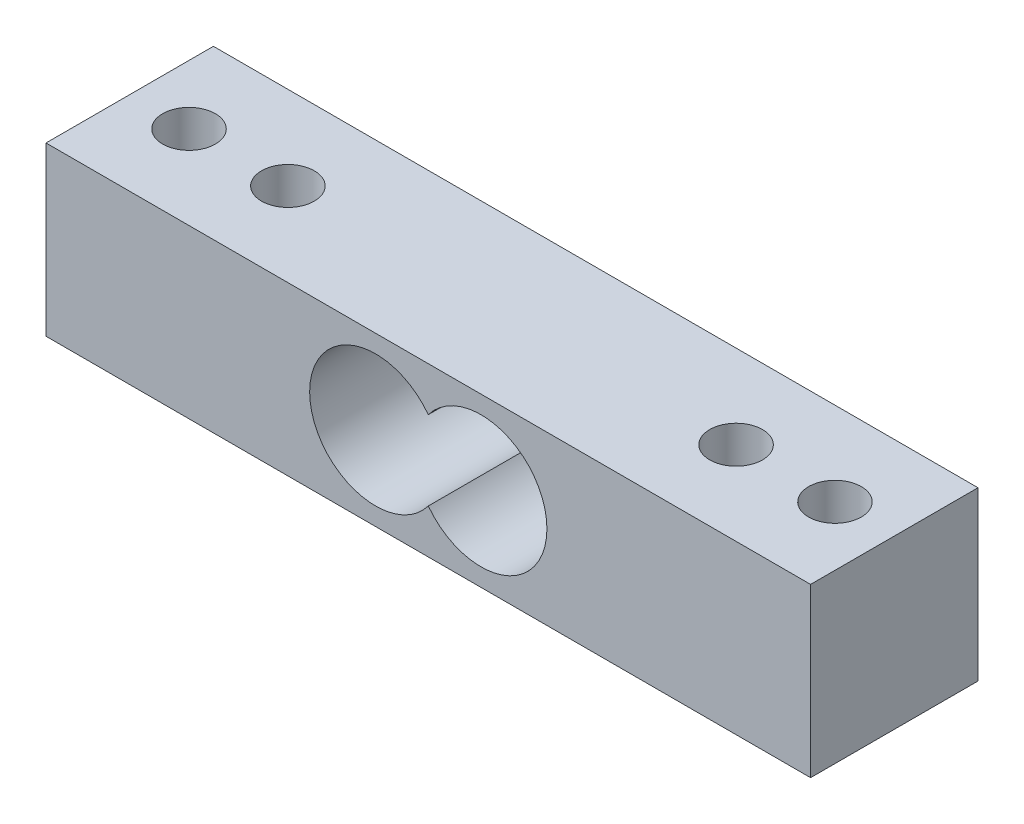
ISO-10303-21;
HEADER;
FILE_DESCRIPTION(('STEP AP214'),'2;1');
FILE_NAME('part.step','',(''),(''),'','','');
FILE_SCHEMA(('AUTOMOTIVE_DESIGN { 1 0 10303 214 1 1 1 1 }'));
ENDSEC;
DATA;
#1=APPLICATION_CONTEXT('core data for automotive mechanical design processes');
#2=APPLICATION_PROTOCOL_DEFINITION('international standard','automotive_design',2000,#1);
#3=PRODUCT_CONTEXT('',#1,'mechanical');
#4=PRODUCT('Part','Part','',(#3));
#5=PRODUCT_RELATED_PRODUCT_CATEGORY('part','',(#4));
#6=PRODUCT_DEFINITION_FORMATION('','',#4);
#7=PRODUCT_DEFINITION_CONTEXT('part definition',#1,'design');
#8=PRODUCT_DEFINITION('design','',#6,#7);
#9=PRODUCT_DEFINITION_SHAPE('','',#8);
#10=(LENGTH_UNIT() NAMED_UNIT(*) SI_UNIT(.MILLI.,.METRE.));
#11=(NAMED_UNIT(*) PLANE_ANGLE_UNIT() SI_UNIT($,.RADIAN.));
#12=(NAMED_UNIT(*) SI_UNIT($,.STERADIAN.) SOLID_ANGLE_UNIT());
#13=UNCERTAINTY_MEASURE_WITH_UNIT(LENGTH_MEASURE(1.E-05),#10,'distance_accuracy_value','');
#14=(GEOMETRIC_REPRESENTATION_CONTEXT(3) GLOBAL_UNCERTAINTY_ASSIGNED_CONTEXT((#13)) GLOBAL_UNIT_ASSIGNED_CONTEXT((#10,
#11,#12)) REPRESENTATION_CONTEXT('',''));
#15=CARTESIAN_POINT('',(0.,0.,0.));
#16=DIRECTION('',(0.,0.,1.));
#17=DIRECTION('',(1.,0.,0.));
#18=AXIS2_PLACEMENT_3D('',#15,#16,#17);
#19=CARTESIAN_POINT('',(0.,12.7,0.));
#20=DIRECTION('',(0.,1.,0.));
#21=DIRECTION('',(0.,0.,1.));
#22=AXIS2_PLACEMENT_3D('',#19,#20,#21);
#23=PLANE('',#22);
#24=CARTESIAN_POINT('',(-17.,12.7,0.));
#25=DIRECTION('',(0.,1.,0.));
#26=DIRECTION('',(0.,0.,1.));
#27=AXIS2_PLACEMENT_3D('',#24,#25,#26);
#28=CIRCLE('',#27,2.);
#29=CARTESIAN_POINT('',(-17.,12.7,2.));
#30=VERTEX_POINT('',#29);
#31=EDGE_CURVE('E110',#30,#30,#28,.T.);
#32=ORIENTED_EDGE('',*,*,#31,.F.);
#33=EDGE_LOOP('',(#32));
#34=FACE_BOUND('',#33,.T.);
#35=CARTESIAN_POINT('',(-24.5,12.7,0.));
#36=DIRECTION('',(0.,1.,0.));
#37=DIRECTION('',(0.,0.,1.));
#38=AXIS2_PLACEMENT_3D('',#35,#36,#37);
#39=CIRCLE('',#38,2.);
#40=CARTESIAN_POINT('',(-24.5,12.7,2.));
#41=VERTEX_POINT('',#40);
#42=EDGE_CURVE('E122',#41,#41,#39,.T.);
#43=ORIENTED_EDGE('',*,*,#42,.F.);
#44=EDGE_LOOP('',(#43));
#45=FACE_BOUND('',#44,.T.);
#46=DIRECTION('',(0.,0.,-1.));
#47=VECTOR('',#46,1.);
#48=CARTESIAN_POINT('',(29.,12.7,-6.35));
#49=LINE('',#48,#47);
#50=CARTESIAN_POINT('',(29.,12.7,6.34999999999999));
#51=VERTEX_POINT('',#50);
#52=CARTESIAN_POINT('',(29.,12.7,-6.35));
#53=VERTEX_POINT('',#52);
#54=EDGE_CURVE('E128',#51,#53,#49,.T.);
#55=ORIENTED_EDGE('',*,*,#54,.T.);
#56=DIRECTION('',(-1.,0.,0.));
#57=VECTOR('',#56,1.);
#58=CARTESIAN_POINT('',(-29.,12.7,-6.35));
#59=LINE('',#58,#57);
#60=CARTESIAN_POINT('',(-29.,12.7,-6.35));
#61=VERTEX_POINT('',#60);
#62=EDGE_CURVE('E131',#53,#61,#59,.T.);
#63=ORIENTED_EDGE('',*,*,#62,.T.);
#64=DIRECTION('',(0.,0.,1.));
#65=VECTOR('',#64,1.);
#66=CARTESIAN_POINT('',(-29.,12.7,-6.35));
#67=LINE('',#66,#65);
#68=CARTESIAN_POINT('',(-29.,12.7,6.34999999999999));
#69=VERTEX_POINT('',#68);
#70=EDGE_CURVE('E134',#61,#69,#67,.T.);
#71=ORIENTED_EDGE('',*,*,#70,.T.);
#72=DIRECTION('',(1.,0.,0.));
#73=VECTOR('',#72,1.);
#74=CARTESIAN_POINT('',(-29.,12.7,6.34999999999999));
#75=LINE('',#74,#73);
#76=EDGE_CURVE('E136',#69,#51,#75,.T.);
#77=ORIENTED_EDGE('',*,*,#76,.T.);
#78=EDGE_LOOP('',(#55,#63,#71,#77));
#79=FACE_BOUND('',#78,.T.);
#80=CARTESIAN_POINT('',(24.5,12.7,0.));
#81=DIRECTION('',(0.,1.,0.));
#82=DIRECTION('',(0.,0.,1.));
#83=AXIS2_PLACEMENT_3D('',#80,#81,#82);
#84=CIRCLE('',#83,2.);
#85=CARTESIAN_POINT('',(24.5,12.7,2.));
#86=VERTEX_POINT('',#85);
#87=EDGE_CURVE('E116',#86,#86,#84,.T.);
#88=ORIENTED_EDGE('',*,*,#87,.F.);
#89=EDGE_LOOP('',(#88));
#90=FACE_BOUND('',#89,.T.);
#91=CARTESIAN_POINT('',(17.,12.7,0.));
#92=DIRECTION('',(0.,1.,0.));
#93=DIRECTION('',(0.,0.,1.));
#94=AXIS2_PLACEMENT_3D('',#91,#92,#93);
#95=CIRCLE('',#94,2.);
#96=CARTESIAN_POINT('',(17.,12.7,2.));
#97=VERTEX_POINT('',#96);
#98=EDGE_CURVE('E104',#97,#97,#95,.T.);
#99=ORIENTED_EDGE('',*,*,#98,.F.);
#100=EDGE_LOOP('',(#99));
#101=FACE_BOUND('',#100,.T.);
#102=ADVANCED_FACE('F33',(#34,#45,#79,#90,#101),#23,.T.);
#103=CARTESIAN_POINT('',(0.,0.,0.));
#104=DIRECTION('',(0.,1.,0.));
#105=DIRECTION('',(0.,0.,1.));
#106=AXIS2_PLACEMENT_3D('',#103,#104,#105);
#107=PLANE('',#106);
#108=CARTESIAN_POINT('',(-17.,0.,0.));
#109=DIRECTION('',(0.,1.,0.));
#110=DIRECTION('',(0.,0.,1.));
#111=AXIS2_PLACEMENT_3D('',#108,#109,#110);
#112=CIRCLE('',#111,2.);
#113=CARTESIAN_POINT('',(-17.,0.,2.));
#114=VERTEX_POINT('',#113);
#115=EDGE_CURVE('E107',#114,#114,#112,.T.);
#116=ORIENTED_EDGE('',*,*,#115,.T.);
#117=EDGE_LOOP('',(#116));
#118=FACE_BOUND('',#117,.T.);
#119=CARTESIAN_POINT('',(-24.5,0.,0.));
#120=DIRECTION('',(0.,1.,0.));
#121=DIRECTION('',(0.,0.,1.));
#122=AXIS2_PLACEMENT_3D('',#119,#120,#121);
#123=CIRCLE('',#122,2.);
#124=CARTESIAN_POINT('',(-24.5,0.,2.));
#125=VERTEX_POINT('',#124);
#126=EDGE_CURVE('E119',#125,#125,#123,.T.);
#127=ORIENTED_EDGE('',*,*,#126,.T.);
#128=EDGE_LOOP('',(#127));
#129=FACE_BOUND('',#128,.T.);
#130=DIRECTION('',(0.,0.,-1.));
#131=VECTOR('',#130,1.);
#132=CARTESIAN_POINT('',(29.,0.,-6.35));
#133=LINE('',#132,#131);
#134=CARTESIAN_POINT('',(29.,0.,6.34999999999999));
#135=VERTEX_POINT('',#134);
#136=CARTESIAN_POINT('',(29.,0.,-6.35));
#137=VERTEX_POINT('',#136);
#138=EDGE_CURVE('E125',#135,#137,#133,.T.);
#139=ORIENTED_EDGE('',*,*,#138,.F.);
#140=DIRECTION('',(1.,0.,0.));
#141=VECTOR('',#140,1.);
#142=CARTESIAN_POINT('',(-29.,0.,6.34999999999999));
#143=LINE('',#142,#141);
#144=CARTESIAN_POINT('',(-29.,0.,6.34999999999999));
#145=VERTEX_POINT('',#144);
#146=EDGE_CURVE('E132',#145,#135,#143,.T.);
#147=ORIENTED_EDGE('',*,*,#146,.F.);
#148=DIRECTION('',(0.,0.,1.));
#149=VECTOR('',#148,1.);
#150=CARTESIAN_POINT('',(-29.,0.,-6.35));
#151=LINE('',#150,#149);
#152=CARTESIAN_POINT('',(-29.,0.,-6.35));
#153=VERTEX_POINT('',#152);
#154=EDGE_CURVE('E143',#153,#145,#151,.T.);
#155=ORIENTED_EDGE('',*,*,#154,.F.);
#156=DIRECTION('',(-1.,0.,0.));
#157=VECTOR('',#156,1.);
#158=CARTESIAN_POINT('',(-29.,0.,-6.35));
#159=LINE('',#158,#157);
#160=EDGE_CURVE('E141',#137,#153,#159,.T.);
#161=ORIENTED_EDGE('',*,*,#160,.F.);
#162=EDGE_LOOP('',(#139,#147,#155,#161));
#163=FACE_BOUND('',#162,.T.);
#164=CARTESIAN_POINT('',(24.5,0.,0.));
#165=DIRECTION('',(0.,1.,0.));
#166=DIRECTION('',(0.,0.,1.));
#167=AXIS2_PLACEMENT_3D('',#164,#165,#166);
#168=CIRCLE('',#167,2.);
#169=CARTESIAN_POINT('',(24.5,0.,2.));
#170=VERTEX_POINT('',#169);
#171=EDGE_CURVE('E113',#170,#170,#168,.T.);
#172=ORIENTED_EDGE('',*,*,#171,.T.);
#173=EDGE_LOOP('',(#172));
#174=FACE_BOUND('',#173,.T.);
#175=CARTESIAN_POINT('',(17.,0.,0.));
#176=DIRECTION('',(0.,1.,0.));
#177=DIRECTION('',(0.,0.,1.));
#178=AXIS2_PLACEMENT_3D('',#175,#176,#177);
#179=CIRCLE('',#178,2.);
#180=CARTESIAN_POINT('',(17.,0.,2.));
#181=VERTEX_POINT('',#180);
#182=EDGE_CURVE('E102',#181,#181,#179,.T.);
#183=ORIENTED_EDGE('',*,*,#182,.T.);
#184=EDGE_LOOP('',(#183));
#185=FACE_BOUND('',#184,.T.);
#186=ADVANCED_FACE('F160',(#118,#129,#163,#174,#185),#107,.F.);
#187=CARTESIAN_POINT('',(29.,12.7,-6.35));
#188=DIRECTION('',(-1.,0.,0.));
#189=DIRECTION('',(0.,0.,1.));
#190=AXIS2_PLACEMENT_3D('',#187,#188,#189);
#191=PLANE('',#190);
#192=ORIENTED_EDGE('',*,*,#138,.T.);
#193=DIRECTION('',(0.,-1.,0.));
#194=VECTOR('',#193,1.);
#195=CARTESIAN_POINT('',(29.,12.7,-6.35));
#196=LINE('',#195,#194);
#197=EDGE_CURVE('E11',#53,#137,#196,.T.);
#198=ORIENTED_EDGE('',*,*,#197,.F.);
#199=ORIENTED_EDGE('',*,*,#54,.F.);
#200=DIRECTION('',(0.,-1.,0.));
#201=VECTOR('',#200,1.);
#202=CARTESIAN_POINT('',(29.,12.7,6.34999999999999));
#203=LINE('',#202,#201);
#204=EDGE_CURVE('E138',#51,#135,#203,.T.);
#205=ORIENTED_EDGE('',*,*,#204,.T.);
#206=EDGE_LOOP('',(#192,#198,#199,#205));
#207=FACE_BOUND('',#206,.T.);
#208=ADVANCED_FACE('F35',(#207),#191,.F.);
#209=CARTESIAN_POINT('',(-29.,12.7,-6.35));
#210=DIRECTION('',(0.,0.,1.));
#211=DIRECTION('',(1.,0.,0.));
#212=AXIS2_PLACEMENT_3D('',#209,#210,#211);
#213=PLANE('',#212);
#214=CARTESIAN_POINT('',(-4.,6.35,-6.35));
#215=DIRECTION('',(0.,0.,1.));
#216=DIRECTION('',(1.,0.,0.));
#217=AXIS2_PLACEMENT_3D('',#214,#215,#216);
#218=CIRCLE('',#217,5.);
#219=CARTESIAN_POINT('',(0.,9.35,-6.35));
#220=VERTEX_POINT('',#219);
#221=CARTESIAN_POINT('',(0.,3.35,-6.35));
#222=VERTEX_POINT('',#221);
#223=EDGE_CURVE('E89',#220,#222,#218,.T.);
#224=ORIENTED_EDGE('',*,*,#223,.T.);
#225=CARTESIAN_POINT('',(4.,6.35,-6.35));
#226=DIRECTION('',(0.,0.,1.));
#227=DIRECTION('',(1.,0.,0.));
#228=AXIS2_PLACEMENT_3D('',#225,#226,#227);
#229=CIRCLE('',#228,5.);
#230=EDGE_CURVE('E48',#222,#220,#229,.T.);
#231=ORIENTED_EDGE('',*,*,#230,.T.);
#232=EDGE_LOOP('',(#224,#231));
#233=FACE_BOUND('',#232,.T.);
#234=ORIENTED_EDGE('',*,*,#160,.T.);
#235=DIRECTION('',(0.,-1.,0.));
#236=VECTOR('',#235,1.);
#237=CARTESIAN_POINT('',(-29.,12.7,-6.35));
#238=LINE('',#237,#236);
#239=EDGE_CURVE('E41',#61,#153,#238,.T.);
#240=ORIENTED_EDGE('',*,*,#239,.F.);
#241=ORIENTED_EDGE('',*,*,#62,.F.);
#242=ORIENTED_EDGE('',*,*,#197,.T.);
#243=EDGE_LOOP('',(#234,#240,#241,#242));
#244=FACE_BOUND('',#243,.T.);
#245=ADVANCED_FACE('F95',(#233,#244),#213,.F.);
#246=CARTESIAN_POINT('',(-29.,12.7,-6.35));
#247=DIRECTION('',(1.,0.,0.));
#248=DIRECTION('',(0.,0.,-1.));
#249=AXIS2_PLACEMENT_3D('',#246,#247,#248);
#250=PLANE('',#249);
#251=ORIENTED_EDGE('',*,*,#154,.T.);
#252=DIRECTION('',(0.,-1.,0.));
#253=VECTOR('',#252,1.);
#254=CARTESIAN_POINT('',(-29.,12.7,6.34999999999999));
#255=LINE('',#254,#253);
#256=EDGE_CURVE('E148',#69,#145,#255,.T.);
#257=ORIENTED_EDGE('',*,*,#256,.F.);
#258=ORIENTED_EDGE('',*,*,#70,.F.);
#259=ORIENTED_EDGE('',*,*,#239,.T.);
#260=EDGE_LOOP('',(#251,#257,#258,#259));
#261=FACE_BOUND('',#260,.T.);
#262=ADVANCED_FACE('F155',(#261),#250,.F.);
#263=CARTESIAN_POINT('',(-29.,12.7,6.34999999999999));
#264=DIRECTION('',(0.,0.,-1.));
#265=DIRECTION('',(-1.,0.,0.));
#266=AXIS2_PLACEMENT_3D('',#263,#264,#265);
#267=PLANE('',#266);
#268=CARTESIAN_POINT('',(-4.,6.35,6.34999999999999));
#269=DIRECTION('',(0.,0.,1.));
#270=DIRECTION('',(1.,0.,0.));
#271=AXIS2_PLACEMENT_3D('',#268,#269,#270);
#272=CIRCLE('',#271,5.);
#273=CARTESIAN_POINT('',(0.,9.35,6.34999999999999));
#274=VERTEX_POINT('',#273);
#275=CARTESIAN_POINT('',(0.,3.35,6.34999999999999));
#276=VERTEX_POINT('',#275);
#277=EDGE_CURVE('E97',#274,#276,#272,.T.);
#278=ORIENTED_EDGE('',*,*,#277,.F.);
#279=CARTESIAN_POINT('',(4.,6.35,6.34999999999999));
#280=DIRECTION('',(0.,0.,1.));
#281=DIRECTION('',(1.,0.,0.));
#282=AXIS2_PLACEMENT_3D('',#279,#280,#281);
#283=CIRCLE('',#282,5.);
#284=EDGE_CURVE('E53',#276,#274,#283,.T.);
#285=ORIENTED_EDGE('',*,*,#284,.F.);
#286=EDGE_LOOP('',(#278,#285));
#287=FACE_BOUND('',#286,.T.);
#288=ORIENTED_EDGE('',*,*,#146,.T.);
#289=ORIENTED_EDGE('',*,*,#204,.F.);
#290=ORIENTED_EDGE('',*,*,#76,.F.);
#291=ORIENTED_EDGE('',*,*,#256,.T.);
#292=EDGE_LOOP('',(#288,#289,#290,#291));
#293=FACE_BOUND('',#292,.T.);
#294=ADVANCED_FACE('F164',(#287,#293),#267,.F.);
#295=CARTESIAN_POINT('',(-24.5,12.7,0.));
#296=DIRECTION('',(0.,-1.,0.));
#297=DIRECTION('',(0.,0.,-1.));
#298=AXIS2_PLACEMENT_3D('',#295,#296,#297);
#299=CYLINDRICAL_SURFACE('',#298,2.);
#300=ORIENTED_EDGE('',*,*,#42,.T.);
#301=EDGE_LOOP('',(#300));
#302=FACE_BOUND('',#301,.T.);
#303=ORIENTED_EDGE('',*,*,#126,.F.);
#304=EDGE_LOOP('',(#303));
#305=FACE_BOUND('',#304,.T.);
#306=ADVANCED_FACE('F188',(#302,#305),#299,.F.);
#307=CARTESIAN_POINT('',(24.5,12.7,0.));
#308=DIRECTION('',(0.,-1.,0.));
#309=DIRECTION('',(0.,0.,-1.));
#310=AXIS2_PLACEMENT_3D('',#307,#308,#309);
#311=CYLINDRICAL_SURFACE('',#310,2.);
#312=ORIENTED_EDGE('',*,*,#87,.T.);
#313=EDGE_LOOP('',(#312));
#314=FACE_BOUND('',#313,.T.);
#315=ORIENTED_EDGE('',*,*,#171,.F.);
#316=EDGE_LOOP('',(#315));
#317=FACE_BOUND('',#316,.T.);
#318=ADVANCED_FACE('F196',(#314,#317),#311,.F.);
#319=CARTESIAN_POINT('',(-17.,12.7,0.));
#320=DIRECTION('',(0.,-1.,0.));
#321=DIRECTION('',(0.,0.,-1.));
#322=AXIS2_PLACEMENT_3D('',#319,#320,#321);
#323=CYLINDRICAL_SURFACE('',#322,2.);
#324=ORIENTED_EDGE('',*,*,#31,.T.);
#325=EDGE_LOOP('',(#324));
#326=FACE_BOUND('',#325,.T.);
#327=ORIENTED_EDGE('',*,*,#115,.F.);
#328=EDGE_LOOP('',(#327));
#329=FACE_BOUND('',#328,.T.);
#330=ADVANCED_FACE('F201',(#326,#329),#323,.F.);
#331=CARTESIAN_POINT('',(17.,12.7,0.));
#332=DIRECTION('',(0.,-1.,0.));
#333=DIRECTION('',(0.,0.,-1.));
#334=AXIS2_PLACEMENT_3D('',#331,#332,#333);
#335=CYLINDRICAL_SURFACE('',#334,2.);
#336=ORIENTED_EDGE('',*,*,#98,.T.);
#337=EDGE_LOOP('',(#336));
#338=FACE_BOUND('',#337,.T.);
#339=ORIENTED_EDGE('',*,*,#182,.F.);
#340=EDGE_LOOP('',(#339));
#341=FACE_BOUND('',#340,.T.);
#342=ADVANCED_FACE('F210',(#338,#341),#335,.F.);
#343=CARTESIAN_POINT('',(4.,6.35,-6.35));
#344=DIRECTION('',(0.,0.,1.));
#345=DIRECTION('',(1.,0.,0.));
#346=AXIS2_PLACEMENT_3D('',#343,#344,#345);
#347=CYLINDRICAL_SURFACE('',#346,5.);
#348=ORIENTED_EDGE('',*,*,#284,.T.);
#349=DIRECTION('',(0.,0.,1.));
#350=VECTOR('',#349,1.);
#351=CARTESIAN_POINT('',(0.,9.35,-6.35));
#352=LINE('',#351,#350);
#353=EDGE_CURVE('E82',#220,#274,#352,.T.);
#354=ORIENTED_EDGE('',*,*,#353,.F.);
#355=ORIENTED_EDGE('',*,*,#230,.F.);
#356=DIRECTION('',(0.,0.,1.));
#357=VECTOR('',#356,1.);
#358=CARTESIAN_POINT('',(0.,3.35,-6.35));
#359=LINE('',#358,#357);
#360=EDGE_CURVE('E88',#222,#276,#359,.T.);
#361=ORIENTED_EDGE('',*,*,#360,.T.);
#362=EDGE_LOOP('',(#348,#354,#355,#361));
#363=FACE_BOUND('',#362,.T.);
#364=ADVANCED_FACE('F84',(#363),#347,.F.);
#365=CARTESIAN_POINT('',(-4.,6.35,-6.35));
#366=DIRECTION('',(0.,0.,1.));
#367=DIRECTION('',(1.,0.,0.));
#368=AXIS2_PLACEMENT_3D('',#365,#366,#367);
#369=CYLINDRICAL_SURFACE('',#368,5.);
#370=ORIENTED_EDGE('',*,*,#277,.T.);
#371=ORIENTED_EDGE('',*,*,#360,.F.);
#372=ORIENTED_EDGE('',*,*,#223,.F.);
#373=ORIENTED_EDGE('',*,*,#353,.T.);
#374=EDGE_LOOP('',(#370,#371,#372,#373));
#375=FACE_BOUND('',#374,.T.);
#376=ADVANCED_FACE('F92',(#375),#369,.F.);
#377=CLOSED_SHELL('',(#102,#186,#208,#245,#262,#294,#306,#318,#330,#342,#364,#376));
#378=MANIFOLD_SOLID_BREP('B2',#377);
#379=ADVANCED_BREP_SHAPE_REPRESENTATION('',(#18,#378),#14);
#380=SHAPE_DEFINITION_REPRESENTATION(#9,#379);
ENDSEC;
END-ISO-10303-21;
